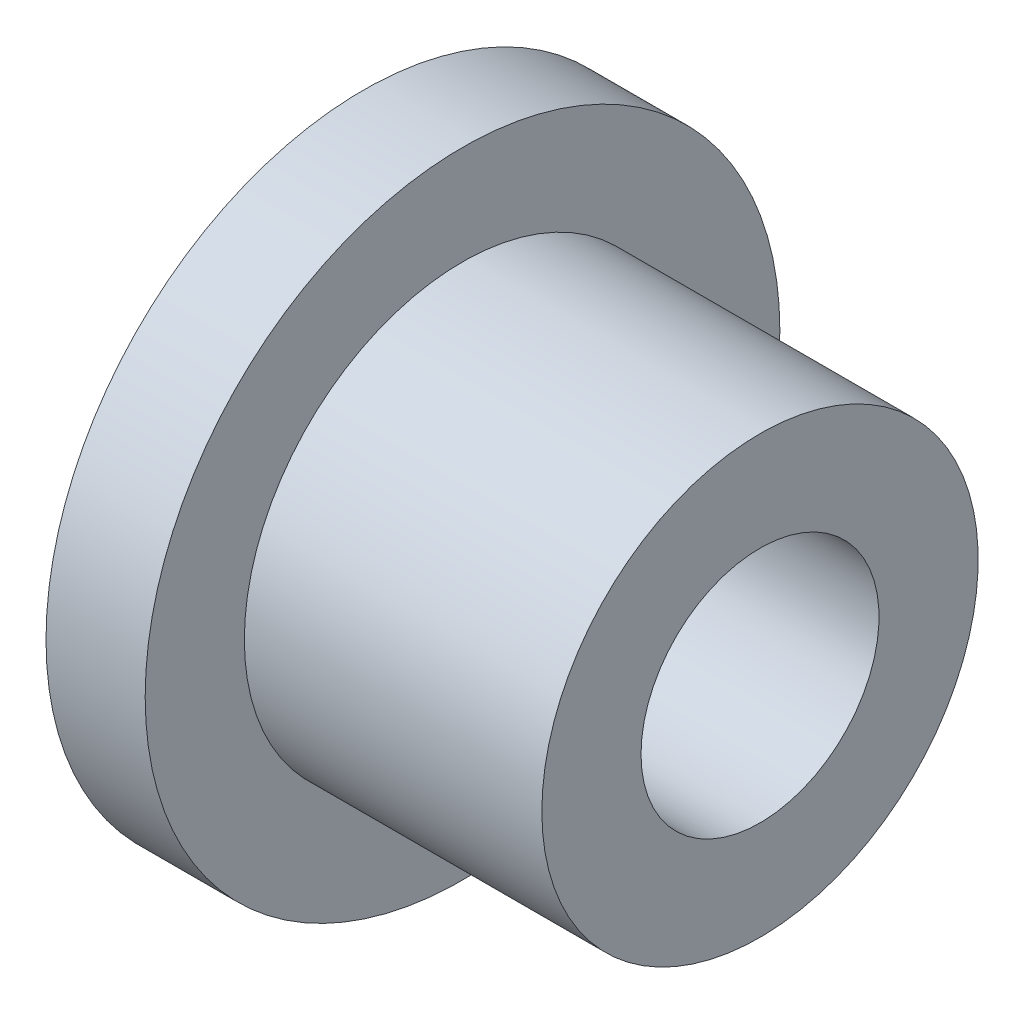
ISO-10303-21;
HEADER;
FILE_DESCRIPTION(('STEP AP214'),'2;1');
FILE_NAME('part.step','',(''),(''),'','','');
FILE_SCHEMA(('AUTOMOTIVE_DESIGN { 1 0 10303 214 1 1 1 1 }'));
ENDSEC;
DATA;
#1=APPLICATION_CONTEXT('core data for automotive mechanical design processes');
#2=APPLICATION_PROTOCOL_DEFINITION('international standard','automotive_design',2000,#1);
#3=PRODUCT_CONTEXT('',#1,'mechanical');
#4=PRODUCT('Part','Part','',(#3));
#5=PRODUCT_RELATED_PRODUCT_CATEGORY('part','',(#4));
#6=PRODUCT_DEFINITION_FORMATION('','',#4);
#7=PRODUCT_DEFINITION_CONTEXT('part definition',#1,'design');
#8=PRODUCT_DEFINITION('design','',#6,#7);
#9=PRODUCT_DEFINITION_SHAPE('','',#8);
#10=(LENGTH_UNIT() NAMED_UNIT(*) SI_UNIT(.MILLI.,.METRE.));
#11=(NAMED_UNIT(*) PLANE_ANGLE_UNIT() SI_UNIT($,.RADIAN.));
#12=(NAMED_UNIT(*) SI_UNIT($,.STERADIAN.) SOLID_ANGLE_UNIT());
#13=UNCERTAINTY_MEASURE_WITH_UNIT(LENGTH_MEASURE(1.E-05),#10,'distance_accuracy_value','');
#14=(GEOMETRIC_REPRESENTATION_CONTEXT(3) GLOBAL_UNCERTAINTY_ASSIGNED_CONTEXT((#13)) GLOBAL_UNIT_ASSIGNED_CONTEXT((#10,
#11,#12)) REPRESENTATION_CONTEXT('',''));
#15=CARTESIAN_POINT('',(0.,0.,0.));
#16=DIRECTION('',(0.,0.,1.));
#17=DIRECTION('',(1.,0.,0.));
#18=AXIS2_PLACEMENT_3D('',#15,#16,#17);
#19=CARTESIAN_POINT('',(-20.,0.,0.));
#20=DIRECTION('',(-1.,0.,0.));
#21=DIRECTION('',(0.,0.,1.));
#22=AXIS2_PLACEMENT_3D('',#19,#20,#21);
#23=CYLINDRICAL_SURFACE('',#22,6.);
#24=CARTESIAN_POINT('',(20.,0.,0.));
#25=DIRECTION('',(-1.,0.,0.));
#26=DIRECTION('',(0.,0.,1.));
#27=AXIS2_PLACEMENT_3D('',#24,#25,#26);
#28=CIRCLE('',#27,6.);
#29=CARTESIAN_POINT('',(20.,0.,6.));
#30=VERTEX_POINT('',#29);
#31=EDGE_CURVE('E57',#30,#30,#28,.T.);
#32=ORIENTED_EDGE('',*,*,#31,.F.);
#33=EDGE_LOOP('',(#32));
#34=FACE_BOUND('',#33,.T.);
#35=CARTESIAN_POINT('',(0.,0.,0.));
#36=DIRECTION('',(-1.,0.,0.));
#37=DIRECTION('',(0.,0.,1.));
#38=AXIS2_PLACEMENT_3D('',#35,#36,#37);
#39=CIRCLE('',#38,6.);
#40=CARTESIAN_POINT('',(0.,0.,6.));
#41=VERTEX_POINT('',#40);
#42=EDGE_CURVE('E10',#41,#41,#39,.T.);
#43=ORIENTED_EDGE('',*,*,#42,.T.);
#44=EDGE_LOOP('',(#43));
#45=FACE_BOUND('',#44,.T.);
#46=ADVANCED_FACE('F35',(#34,#45),#23,.F.);
#47=CARTESIAN_POINT('',(0.,6.,0.));
#48=DIRECTION('',(1.,0.,0.));
#49=DIRECTION('',(0.,0.,-1.));
#50=AXIS2_PLACEMENT_3D('',#47,#48,#49);
#51=PLANE('',#50);
#52=ORIENTED_EDGE('',*,*,#42,.F.);
#53=EDGE_LOOP('',(#52));
#54=FACE_BOUND('',#53,.T.);
#55=CARTESIAN_POINT('',(0.,0.,0.));
#56=DIRECTION('',(-1.,0.,0.));
#57=DIRECTION('',(0.,0.,1.));
#58=AXIS2_PLACEMENT_3D('',#55,#56,#57);
#59=CIRCLE('',#58,16.);
#60=CARTESIAN_POINT('',(0.,0.,16.));
#61=VERTEX_POINT('',#60);
#62=EDGE_CURVE('E41',#61,#61,#59,.T.);
#63=ORIENTED_EDGE('',*,*,#62,.T.);
#64=EDGE_LOOP('',(#63));
#65=FACE_BOUND('',#64,.T.);
#66=ADVANCED_FACE('F64',(#54,#65),#51,.F.);
#67=CARTESIAN_POINT('',(-20.,0.,0.));
#68=DIRECTION('',(-1.,0.,0.));
#69=DIRECTION('',(0.,0.,1.));
#70=AXIS2_PLACEMENT_3D('',#67,#68,#69);
#71=CYLINDRICAL_SURFACE('',#70,16.);
#72=ORIENTED_EDGE('',*,*,#62,.F.);
#73=EDGE_LOOP('',(#72));
#74=FACE_BOUND('',#73,.T.);
#75=CARTESIAN_POINT('',(5.,0.,0.));
#76=DIRECTION('',(-1.,0.,0.));
#77=DIRECTION('',(0.,0.,1.));
#78=AXIS2_PLACEMENT_3D('',#75,#76,#77);
#79=CIRCLE('',#78,16.);
#80=CARTESIAN_POINT('',(5.,0.,16.));
#81=VERTEX_POINT('',#80);
#82=EDGE_CURVE('E45',#81,#81,#79,.T.);
#83=ORIENTED_EDGE('',*,*,#82,.T.);
#84=EDGE_LOOP('',(#83));
#85=FACE_BOUND('',#84,.T.);
#86=ADVANCED_FACE('F68',(#74,#85),#71,.T.);
#87=CARTESIAN_POINT('',(5.,16.,0.));
#88=DIRECTION('',(-1.,0.,0.));
#89=DIRECTION('',(0.,0.,1.));
#90=AXIS2_PLACEMENT_3D('',#87,#88,#89);
#91=PLANE('',#90);
#92=ORIENTED_EDGE('',*,*,#82,.F.);
#93=EDGE_LOOP('',(#92));
#94=FACE_BOUND('',#93,.T.);
#95=CARTESIAN_POINT('',(5.,0.,0.));
#96=DIRECTION('',(-1.,0.,0.));
#97=DIRECTION('',(0.,0.,1.));
#98=AXIS2_PLACEMENT_3D('',#95,#96,#97);
#99=CIRCLE('',#98,11.);
#100=CARTESIAN_POINT('',(5.,0.,11.));
#101=VERTEX_POINT('',#100);
#102=EDGE_CURVE('E49',#101,#101,#99,.T.);
#103=ORIENTED_EDGE('',*,*,#102,.T.);
#104=EDGE_LOOP('',(#103));
#105=FACE_BOUND('',#104,.T.);
#106=ADVANCED_FACE('F73',(#94,#105),#91,.F.);
#107=CARTESIAN_POINT('',(-20.,0.,0.));
#108=DIRECTION('',(-1.,0.,0.));
#109=DIRECTION('',(0.,0.,1.));
#110=AXIS2_PLACEMENT_3D('',#107,#108,#109);
#111=CYLINDRICAL_SURFACE('',#110,11.);
#112=ORIENTED_EDGE('',*,*,#102,.F.);
#113=EDGE_LOOP('',(#112));
#114=FACE_BOUND('',#113,.T.);
#115=CARTESIAN_POINT('',(20.,0.,0.));
#116=DIRECTION('',(-1.,0.,0.));
#117=DIRECTION('',(0.,0.,1.));
#118=AXIS2_PLACEMENT_3D('',#115,#116,#117);
#119=CIRCLE('',#118,11.);
#120=CARTESIAN_POINT('',(20.,0.,11.));
#121=VERTEX_POINT('',#120);
#122=EDGE_CURVE('E54',#121,#121,#119,.T.);
#123=ORIENTED_EDGE('',*,*,#122,.T.);
#124=EDGE_LOOP('',(#123));
#125=FACE_BOUND('',#124,.T.);
#126=ADVANCED_FACE('F79',(#114,#125),#111,.T.);
#127=CARTESIAN_POINT('',(20.,11.,0.));
#128=DIRECTION('',(-1.,0.,0.));
#129=DIRECTION('',(0.,0.,1.));
#130=AXIS2_PLACEMENT_3D('',#127,#128,#129);
#131=PLANE('',#130);
#132=ORIENTED_EDGE('',*,*,#122,.F.);
#133=EDGE_LOOP('',(#132));
#134=FACE_BOUND('',#133,.T.);
#135=ORIENTED_EDGE('',*,*,#31,.T.);
#136=EDGE_LOOP('',(#135));
#137=FACE_BOUND('',#136,.T.);
#138=ADVANCED_FACE('F61',(#134,#137),#131,.F.);
#139=CLOSED_SHELL('',(#46,#66,#86,#106,#126,#138));
#140=MANIFOLD_SOLID_BREP('B2',#139);
#141=ADVANCED_BREP_SHAPE_REPRESENTATION('',(#18,#140),#14);
#142=SHAPE_DEFINITION_REPRESENTATION(#9,#141);
ENDSEC;
END-ISO-10303-21;
